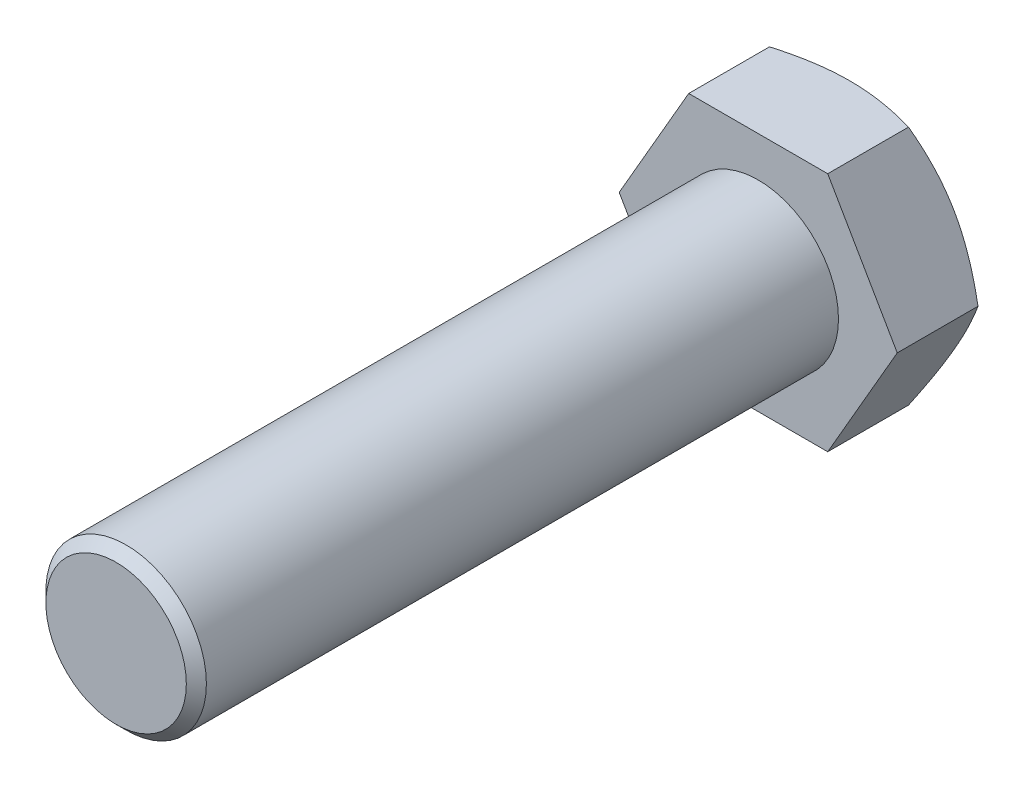
ISO-10303-21;
HEADER;
FILE_DESCRIPTION(('STEP AP214'),'2;1');
FILE_NAME('part.step','',(''),(''),'','','');
FILE_SCHEMA(('AUTOMOTIVE_DESIGN { 1 0 10303 214 1 1 1 1 }'));
ENDSEC;
DATA;
#1=APPLICATION_CONTEXT('core data for automotive mechanical design processes');
#2=APPLICATION_PROTOCOL_DEFINITION('international standard','automotive_design',2000,#1);
#3=PRODUCT_CONTEXT('',#1,'mechanical');
#4=PRODUCT('Part','Part','',(#3));
#5=PRODUCT_RELATED_PRODUCT_CATEGORY('part','',(#4));
#6=PRODUCT_DEFINITION_FORMATION('','',#4);
#7=PRODUCT_DEFINITION_CONTEXT('part definition',#1,'design');
#8=PRODUCT_DEFINITION('design','',#6,#7);
#9=PRODUCT_DEFINITION_SHAPE('','',#8);
#10=(LENGTH_UNIT() NAMED_UNIT(*) SI_UNIT(.MILLI.,.METRE.));
#11=(NAMED_UNIT(*) PLANE_ANGLE_UNIT() SI_UNIT($,.RADIAN.));
#12=(NAMED_UNIT(*) SI_UNIT($,.STERADIAN.) SOLID_ANGLE_UNIT());
#13=UNCERTAINTY_MEASURE_WITH_UNIT(LENGTH_MEASURE(1.E-05),#10,'distance_accuracy_value','');
#14=(GEOMETRIC_REPRESENTATION_CONTEXT(3) GLOBAL_UNCERTAINTY_ASSIGNED_CONTEXT((#13)) GLOBAL_UNIT_ASSIGNED_CONTEXT((#10,
#11,#12)) REPRESENTATION_CONTEXT('',''));
#15=CARTESIAN_POINT('',(0.,0.,0.));
#16=DIRECTION('',(0.,0.,1.));
#17=DIRECTION('',(1.,0.,0.));
#18=AXIS2_PLACEMENT_3D('',#15,#16,#17);
#19=CARTESIAN_POINT('',(0.,0.,0.));
#20=DIRECTION('',(0.,0.,1.));
#21=DIRECTION('',(1.,0.,0.));
#22=AXIS2_PLACEMENT_3D('',#19,#20,#21);
#23=PLANE('',#22);
#24=DIRECTION('',(-0.5,0.866025403784438,0.));
#25=VECTOR('',#24,1.);
#26=CARTESIAN_POINT('',(10.9985226280624,0.,0.));
#27=LINE('',#26,#25);
#28=CARTESIAN_POINT('',(10.9985226280624,0.,0.));
#29=VERTEX_POINT('',#28);
#30=CARTESIAN_POINT('',(5.49926131403118,9.525,0.));
#31=VERTEX_POINT('',#30);
#32=EDGE_CURVE('E251',#29,#31,#27,.T.);
#33=ORIENTED_EDGE('',*,*,#32,.T.);
#34=DIRECTION('',(-1.,0.,0.));
#35=VECTOR('',#34,1.);
#36=CARTESIAN_POINT('',(5.49926131403118,9.525,0.));
#37=LINE('',#36,#35);
#38=CARTESIAN_POINT('',(-5.49926131403119,9.525,0.));
#39=VERTEX_POINT('',#38);
#40=EDGE_CURVE('E271',#31,#39,#37,.T.);
#41=ORIENTED_EDGE('',*,*,#40,.T.);
#42=DIRECTION('',(-0.5,-0.866025403784439,0.));
#43=VECTOR('',#42,1.);
#44=CARTESIAN_POINT('',(-5.49926131403119,9.525,0.));
#45=LINE('',#44,#43);
#46=CARTESIAN_POINT('',(-10.9985226280624,0.,0.));
#47=VERTEX_POINT('',#46);
#48=EDGE_CURVE('E269',#39,#47,#45,.T.);
#49=ORIENTED_EDGE('',*,*,#48,.T.);
#50=DIRECTION('',(0.5,-0.866025403784438,0.));
#51=VECTOR('',#50,1.);
#52=CARTESIAN_POINT('',(-10.9985226280624,0.,0.));
#53=LINE('',#52,#51);
#54=CARTESIAN_POINT('',(-5.49926131403117,-9.52500000000001,0.));
#55=VERTEX_POINT('',#54);
#56=EDGE_CURVE('E126',#47,#55,#53,.T.);
#57=ORIENTED_EDGE('',*,*,#56,.T.);
#58=DIRECTION('',(1.,0.,0.));
#59=VECTOR('',#58,1.);
#60=CARTESIAN_POINT('',(-5.49926131403117,-9.52500000000001,0.));
#61=LINE('',#60,#59);
#62=CARTESIAN_POINT('',(5.49926131403119,-9.525,0.));
#63=VERTEX_POINT('',#62);
#64=EDGE_CURVE('E265',#55,#63,#61,.T.);
#65=ORIENTED_EDGE('',*,*,#64,.T.);
#66=DIRECTION('',(0.5,0.866025403784439,0.));
#67=VECTOR('',#66,1.);
#68=CARTESIAN_POINT('',(5.49926131403119,-9.525,0.));
#69=LINE('',#68,#67);
#70=EDGE_CURVE('E138',#63,#29,#69,.T.);
#71=ORIENTED_EDGE('',*,*,#70,.T.);
#72=EDGE_LOOP('',(#33,#41,#49,#57,#65,#71));
#73=FACE_BOUND('',#72,.T.);
#74=CARTESIAN_POINT('',(0.,0.,0.));
#75=DIRECTION('',(0.,0.,1.));
#76=DIRECTION('',(1.,0.,0.));
#77=AXIS2_PLACEMENT_3D('',#74,#75,#76);
#78=CIRCLE('',#77,6.35);
#79=CARTESIAN_POINT('',(6.35,0.,0.));
#80=VERTEX_POINT('',#79);
#81=EDGE_CURVE('E254',#80,#80,#78,.T.);
#82=ORIENTED_EDGE('',*,*,#81,.F.);
#83=EDGE_LOOP('',(#82));
#84=FACE_BOUND('',#83,.T.);
#85=ADVANCED_FACE('F33',(#73,#84),#23,.T.);
#86=CARTESIAN_POINT('',(10.9985226280624,0.,-7.239));
#87=DIRECTION('',(0.866025403784438,0.5,0.));
#88=DIRECTION('',(-0.5,0.866025403784439,0.));
#89=AXIS2_PLACEMENT_3D('',#86,#87,#88);
#90=PLANE('',#89);
#91=DIRECTION('',(0.,0.,1.));
#92=VECTOR('',#91,1.);
#93=CARTESIAN_POINT('',(10.9985226280624,0.,-7.239));
#94=LINE('',#93,#92);
#95=CARTESIAN_POINT('',(10.9985226280624,0.,-6.3882613140312));
#96=VERTEX_POINT('',#95);
#97=EDGE_CURVE('E142',#96,#29,#94,.T.);
#98=ORIENTED_EDGE('',*,*,#97,.F.);
#99=CARTESIAN_POINT('',(10.9986380981162,-0.000199999999994921,-6.38819464631467));
#100=CARTESIAN_POINT('',(10.8777523132173,0.20918032135782,-6.45797679875236));
#101=CARTESIAN_POINT('',(10.7564158029679,0.419341321922851,-6.52459176604214));
#102=CARTESIAN_POINT('',(10.5127697532954,0.841348659019081,-6.65060853020999));
#103=CARTESIAN_POINT('',(10.3904599078574,1.05319552558364,-6.71000795469023));
#104=CARTESIAN_POINT('',(10.0215595864394,1.69214962520808,-6.87623339529241));
#105=CARTESIAN_POINT('',(9.77351282584137,2.12177921721668,-6.97078167008118));
#106=CARTESIAN_POINT('',(9.40232220358294,2.76470023426138,-7.08164837115457));
#107=CARTESIAN_POINT('',(9.28028730086356,2.97607088606807,-7.11323013385105));
#108=CARTESIAN_POINT('',(9.03565248016183,3.39979082482397,-7.1661907468708));
#109=CARTESIAN_POINT('',(8.9130525513505,3.61214013052952,-7.18756940081897));
#110=CARTESIAN_POINT('',(8.66764818787802,4.03719295646296,-7.21957602332752));
#111=CARTESIAN_POINT('',(8.54484417077186,4.24989575346439,-7.2302167674145));
#112=CARTESIAN_POINT('',(8.29912270270345,4.67549782066928,-7.24052146504908));
#113=CARTESIAN_POINT('',(8.17620525536319,4.88839708459929,-7.24018575773535));
#114=CARTESIAN_POINT('',(7.94640807689151,5.28641747314822,-7.22930115976822));
#115=CARTESIAN_POINT('',(7.83951212670956,5.4715666899867,-7.22008005549243));
#116=CARTESIAN_POINT('',(7.62597023317658,5.84143209913029,-7.19351519898844));
#117=CARTESIAN_POINT('',(7.5193243080471,6.02614825987472,-7.17617087217475));
#118=CARTESIAN_POINT('',(7.19979976097279,6.57958100967286,-7.11236312197425));
#119=CARTESIAN_POINT('',(6.98748672019119,6.94731798341605,-7.05413287852844));
#120=CARTESIAN_POINT('',(6.56060850831896,7.68669273502289,-6.90855670802923));
#121=CARTESIAN_POINT('',(6.3460978161353,8.05823615265175,-6.82059370365355));
#122=CARTESIAN_POINT('',(5.92027529884848,8.79578238759941,-6.62095420264402));
#123=CARTESIAN_POINT('',(5.70895802095901,9.16179464942111,-6.50932459453986));
#124=CARTESIAN_POINT('',(5.49914584397735,9.5252,-6.38819464631468));
#125=B_SPLINE_CURVE_WITH_KNOTS('',3,(#99,#100,#101,#102,#103,#104,#105,#106,#107,#108,#109,#110,
#111,#112,#113,#114,#115,#116,#117,#118,#119,#120,#121,#122,#123,#124),.UNSPECIFIED.,.F.,.F.,(4,
2,2,2,2,2,2,2,2,2,2,2,4),(0.,0.754861746958002,1.50997101692211,3.0234040607515,
3.76154608748042,4.49970232035706,5.23697928598071,5.97423347202912,6.61604550518407,
7.25790294292823,8.54252993638601,9.85564695316762,11.1661863217646),.UNSPECIFIED.);
#126=CARTESIAN_POINT('',(8.24889197104678,4.7625,-7.239));
#127=VERTEX_POINT('',#126);
#128=EDGE_CURVE('E122',#96,#127,#125,.T.);
#129=ORIENTED_EDGE('',*,*,#128,.T.);
#130=CARTESIAN_POINT('',(5.49926131403118,9.525,-6.3882613140312));
#131=VERTEX_POINT('',#130);
#132=EDGE_CURVE('E217',#127,#131,#125,.T.);
#133=ORIENTED_EDGE('',*,*,#132,.T.);
#134=DIRECTION('',(0.,0.,1.));
#135=VECTOR('',#134,1.);
#136=CARTESIAN_POINT('',(5.49926131403118,9.525,-7.239));
#137=LINE('',#136,#135);
#138=EDGE_CURVE('E133',#131,#31,#137,.T.);
#139=ORIENTED_EDGE('',*,*,#138,.T.);
#140=ORIENTED_EDGE('',*,*,#32,.F.);
#141=EDGE_LOOP('',(#98,#129,#133,#139,#140));
#142=FACE_BOUND('',#141,.T.);
#143=ADVANCED_FACE('F222',(#142),#90,.T.);
#144=CARTESIAN_POINT('',(5.49926131403119,-9.525,-7.239));
#145=DIRECTION('',(0.866025403784439,-0.5,0.));
#146=DIRECTION('',(0.5,0.866025403784439,0.));
#147=AXIS2_PLACEMENT_3D('',#144,#145,#146);
#148=PLANE('',#147);
#149=DIRECTION('',(0.,0.,1.));
#150=VECTOR('',#149,1.);
#151=CARTESIAN_POINT('',(5.49926131403119,-9.525,-7.239));
#152=LINE('',#151,#150);
#153=CARTESIAN_POINT('',(5.49926131403118,-9.525,-6.3882613140312));
#154=VERTEX_POINT('',#153);
#155=EDGE_CURVE('E131',#154,#63,#152,.T.);
#156=ORIENTED_EDGE('',*,*,#155,.F.);
#157=CARTESIAN_POINT('',(5.49914584397735,-9.5252,-6.38819464631467));
#158=CARTESIAN_POINT('',(5.6200316288763,-9.31581967864219,-6.45797679875236));
#159=CARTESIAN_POINT('',(5.74136813912568,-9.10565867807716,-6.52459176604213));
#160=CARTESIAN_POINT('',(5.98501418879818,-8.68365134098092,-6.65060853020998));
#161=CARTESIAN_POINT('',(6.10732403423621,-8.47180447441637,-6.71000795469023));
#162=CARTESIAN_POINT('',(6.47622435565419,-7.83285037479193,-6.87623339529241));
#163=CARTESIAN_POINT('',(6.72427111625219,-7.40322078278332,-6.97078167008118));
#164=CARTESIAN_POINT('',(7.09546173851062,-6.76029976573862,-7.08164837115457));
#165=CARTESIAN_POINT('',(7.21749664122999,-6.54892911393193,-7.11323013385105));
#166=CARTESIAN_POINT('',(7.46213146193172,-6.12520917517604,-7.1661907468708));
#167=CARTESIAN_POINT('',(7.58473139074305,-5.91285986947049,-7.18756940081897));
#168=CARTESIAN_POINT('',(7.83013575421554,-5.48780704353704,-7.21957602332752));
#169=CARTESIAN_POINT('',(7.9529397713217,-5.27510424653562,-7.2302167674145));
#170=CARTESIAN_POINT('',(8.1986612393901,-4.84950217933072,-7.24052146504908));
#171=CARTESIAN_POINT('',(8.32157868673037,-4.63660291540071,-7.24018575773535));
#172=CARTESIAN_POINT('',(8.55137586520205,-4.23858252685179,-7.22930115976822));
#173=CARTESIAN_POINT('',(8.65827181538399,-4.05343331001331,-7.22008005549243));
#174=CARTESIAN_POINT('',(8.87181370891698,-3.68356790086971,-7.19351519898844));
#175=CARTESIAN_POINT('',(8.97845963404645,-3.49885174012528,-7.17617087217475));
#176=CARTESIAN_POINT('',(9.29798418112076,-2.94541899032714,-7.11236312197425));
#177=CARTESIAN_POINT('',(9.51029722190237,-2.57768201658395,-7.05413287852844));
#178=CARTESIAN_POINT('',(9.93717543377459,-1.83830726497711,-6.90855670802923));
#179=CARTESIAN_POINT('',(10.1516861259582,-1.46676384734824,-6.82059370365355));
#180=CARTESIAN_POINT('',(10.5775086432451,-0.729217612400583,-6.62095420264402));
#181=CARTESIAN_POINT('',(10.7888259211345,-0.363205350578882,-6.50932459453986));
#182=CARTESIAN_POINT('',(10.9986380981162,0.000200000000004332,-6.38819464631467));
#183=B_SPLINE_CURVE_WITH_KNOTS('',3,(#157,#158,#159,#160,#161,#162,#163,#164,#165,#166,#167,
#168,#169,#170,#171,#172,#173,#174,#175,#176,#177,#178,#179,#180,#181,#182),.UNSPECIFIED.,.F.,
.F.,(4,2,2,2,2,2,2,2,2,2,2,2,4),(0.,0.754861746958004,1.50997101692211,3.02340406075151,
3.76154608748042,4.49970232035706,5.23697928598072,5.97423347202912,6.61604550518407,
7.25790294292823,8.54252993638601,9.85564695316763,11.1661863217647),.UNSPECIFIED.);
#184=CARTESIAN_POINT('',(8.24889197104678,-4.7625,-7.239));
#185=VERTEX_POINT('',#184);
#186=EDGE_CURVE('E158',#154,#185,#183,.T.);
#187=ORIENTED_EDGE('',*,*,#186,.T.);
#188=EDGE_CURVE('E111',#185,#96,#183,.T.);
#189=ORIENTED_EDGE('',*,*,#188,.T.);
#190=ORIENTED_EDGE('',*,*,#97,.T.);
#191=ORIENTED_EDGE('',*,*,#70,.F.);
#192=EDGE_LOOP('',(#156,#187,#189,#190,#191));
#193=FACE_BOUND('',#192,.T.);
#194=ADVANCED_FACE('F173',(#193),#148,.T.);
#195=CARTESIAN_POINT('',(-5.49926131403117,-9.52500000000001,-7.239));
#196=DIRECTION('',(0.,-1.,0.));
#197=DIRECTION('',(1.,0.,0.));
#198=AXIS2_PLACEMENT_3D('',#195,#196,#197);
#199=PLANE('',#198);
#200=DIRECTION('',(0.,0.,1.));
#201=VECTOR('',#200,1.);
#202=CARTESIAN_POINT('',(-5.49926131403117,-9.52500000000001,-7.239));
#203=LINE('',#202,#201);
#204=CARTESIAN_POINT('',(-5.49926131403118,-9.52500000000001,-6.3882613140312));
#205=VERTEX_POINT('',#204);
#206=EDGE_CURVE('E128',#205,#55,#203,.T.);
#207=ORIENTED_EDGE('',*,*,#206,.F.);
#208=CARTESIAN_POINT('',(-14.5848514260898,-9.52500000000001,-2.68103313192076));
#209=CARTESIAN_POINT('',(-14.3757585121413,-9.52500000000001,-2.78210554675537));
#210=CARTESIAN_POINT('',(-14.1664128636962,-9.52500000000001,-2.88265486746429));
#211=CARTESIAN_POINT('',(-13.747162716616,-9.52500000000001,-3.08258724839842));
#212=CARTESIAN_POINT('',(-13.5372582118854,-9.52500000000001,-3.18197029583857));
#213=CARTESIAN_POINT('',(-12.906564840945,-9.52500000000001,-3.47821872789398));
#214=CARTESIAN_POINT('',(-12.4848640989599,-9.52500000000001,-3.67315044626707));
#215=CARTESIAN_POINT('',(-11.6361353309768,-9.52500000000001,-4.05771439376794));
#216=CARTESIAN_POINT('',(-11.2090906289847,-9.52500000000001,-4.24730991241434));
#217=CARTESIAN_POINT('',(-10.3514920507466,-9.52500000000001,-4.61836058535969));
#218=CARTESIAN_POINT('',(-9.92093835880329,-9.52500000000001,-4.79981616397824));
#219=CARTESIAN_POINT('',(-9.0502907929759,-9.52500000000001,-5.15457151558343));
#220=CARTESIAN_POINT('',(-8.61014468925986,-9.52500000000001,-5.32774381120678));
#221=CARTESIAN_POINT('',(-7.72466213542342,-9.52500000000001,-5.66052594327856));
#222=CARTESIAN_POINT('',(-7.27932511409067,-9.52500000000001,-5.82013427080646));
#223=CARTESIAN_POINT('',(-6.3836613329774,-9.52500000000001,-6.12149889943293));
#224=CARTESIAN_POINT('',(-5.93334748427704,-9.52500000000001,-6.26329315388556));
#225=CARTESIAN_POINT('',(-5.02633416867646,-9.52500000000001,-6.52442703659587));
#226=CARTESIAN_POINT('',(-4.56963677039888,-9.52500000000001,-6.64377376580489));
#227=CARTESIAN_POINT('',(-3.64946810096751,-9.52500000000001,-6.85420992638798));
#228=CARTESIAN_POINT('',(-3.18599506051234,-9.525,-6.94529183389425));
#229=CARTESIAN_POINT('',(-2.48670711335144,-9.525,-7.05615552989782));
#230=CARTESIAN_POINT('',(-2.25290271066244,-9.525,-7.08881930690078));
#231=CARTESIAN_POINT('',(-1.78419772762086,-9.525,-7.1449177834731));
#232=CARTESIAN_POINT('',(-1.54929725812148,-9.525,-7.16835339672454));
#233=CARTESIAN_POINT('',(-1.08020777715576,-9.525,-7.20536486203012));
#234=CARTESIAN_POINT('',(-0.846023616026403,-9.525,-7.21900194006364));
#235=CARTESIAN_POINT('',(-0.377287951032391,-9.525,-7.23634423552121));
#236=CARTESIAN_POINT('',(-0.142736451977726,-9.525,-7.24004958192299));
#237=CARTESIAN_POINT('',(0.326245741164637,-9.525,-7.23744012423018));
#238=CARTESIAN_POINT('',(0.560676450681649,-9.525,-7.23112813226288));
#239=CARTESIAN_POINT('',(1.02906749638298,-9.525,-7.2086409602398));
#240=CARTESIAN_POINT('',(1.26302780849203,-9.525,-7.19246528762909));
#241=CARTESIAN_POINT('',(1.83007556949539,-9.525,-7.141644352162));
#242=CARTESIAN_POINT('',(2.16272734658029,-9.525,-7.10205703256404));
#243=CARTESIAN_POINT('',(2.82548182093543,-9.525,-7.00513945561934));
#244=CARTESIAN_POINT('',(3.15558379720053,-9.525,-6.94780435536234));
#245=CARTESIAN_POINT('',(3.81296633944766,-9.525,-6.81742470975663));
#246=CARTESIAN_POINT('',(4.14024393133904,-9.525,-6.74436531102873));
#247=CARTESIAN_POINT('',(4.79143189370414,-9.525,-6.58476619726766));
#248=CARTESIAN_POINT('',(5.11534257832303,-9.525,-6.49822775214509));
#249=CARTESIAN_POINT('',(5.76777457470679,-9.525,-6.31147877500175));
#250=CARTESIAN_POINT('',(6.0962142824533,-9.525,-6.21098510686575));
#251=CARTESIAN_POINT('',(6.74962208193335,-9.525,-6.00006841523837));
#252=CARTESIAN_POINT('',(7.07459239758527,-9.525,-5.88965224042136));
#253=CARTESIAN_POINT('',(7.71975742553682,-9.525,-5.66117128989833));
#254=CARTESIAN_POINT('',(8.03996872244832,-9.525,-5.5431530638559));
#255=CARTESIAN_POINT('',(8.67790692067937,-9.525,-5.30018961397412));
#256=CARTESIAN_POINT('',(8.99563275784031,-9.525,-5.17524159047859));
#257=CARTESIAN_POINT('',(9.31220433212002,-9.525,-5.04751417817255));
#258=B_SPLINE_CURVE_WITH_KNOTS('',3,(#208,#209,#210,#211,#212,#213,#214,#215,#216,#217,#218,
#219,#220,#221,#222,#223,#224,#225,#226,#227,#228,#229,#230,#231,#232,#233,#234,#235,#236,#237,
#238,#239,#240,#241,#242,#243,#244,#245,#246,#247,#248,#249,#250,#251,#252,#253,#254,#255,#256,
#257),.UNSPECIFIED.,.F.,.F.,(4,2,2,2,2,2,2,2,2,2,2,2,2,2,2,2,2,2,2,2,2,2,2,2,4),(0.,
0.696719050831161,1.39344573218638,2.78712572533338,4.18878118622646,5.59036349637626,
7.00915288747145,8.42809990542333,9.84397061683018,11.2593926818532,12.6751911982718,
13.383262743619,14.0912641650418,14.7948022429185,15.498331184305,16.2016626617624,
16.9050292638122,17.9094666753597,18.9141784138717,19.9198434146362,20.9254137252445,
21.9556327373916,22.9851460585411,24.0088645870761,25.0329997567141),.UNSPECIFIED.);
#259=CARTESIAN_POINT('',(0.,-9.525,-7.239));
#260=VERTEX_POINT('',#259);
#261=EDGE_CURVE('E272',#205,#260,#258,.T.);
#262=ORIENTED_EDGE('',*,*,#261,.T.);
#263=EDGE_CURVE('E160',#260,#154,#258,.T.);
#264=ORIENTED_EDGE('',*,*,#263,.T.);
#265=ORIENTED_EDGE('',*,*,#155,.T.);
#266=ORIENTED_EDGE('',*,*,#64,.F.);
#267=EDGE_LOOP('',(#207,#262,#264,#265,#266));
#268=FACE_BOUND('',#267,.T.);
#269=ADVANCED_FACE('F234',(#268),#199,.T.);
#270=CARTESIAN_POINT('',(-10.9985226280624,0.,-7.239));
#271=DIRECTION('',(-0.866025403784438,-0.5,0.));
#272=DIRECTION('',(0.5,-0.866025403784438,0.));
#273=AXIS2_PLACEMENT_3D('',#270,#271,#272);
#274=PLANE('',#273);
#275=DIRECTION('',(0.,0.,1.));
#276=VECTOR('',#275,1.);
#277=CARTESIAN_POINT('',(-10.9985226280624,0.,-7.239));
#278=LINE('',#277,#276);
#279=CARTESIAN_POINT('',(-10.9985226280624,0.,-6.3882613140312));
#280=VERTEX_POINT('',#279);
#281=EDGE_CURVE('E119',#280,#47,#278,.T.);
#282=ORIENTED_EDGE('',*,*,#281,.F.);
#283=CARTESIAN_POINT('',(-10.9986380981162,0.000199999999994796,-6.38819464631468));
#284=CARTESIAN_POINT('',(-10.8777523132173,-0.20918032135782,-6.45797679875236));
#285=CARTESIAN_POINT('',(-10.7564158029679,-0.41934132192285,-6.52459176604214));
#286=CARTESIAN_POINT('',(-10.5127697532954,-0.841348659019081,-6.65060853020999));
#287=CARTESIAN_POINT('',(-10.3904599078573,-1.05319552558364,-6.71000795469024));
#288=CARTESIAN_POINT('',(-10.0215595864394,-1.69214962520808,-6.87623339529241));
#289=CARTESIAN_POINT('',(-9.77351282584136,-2.12177921721668,-6.97078167008118));
#290=CARTESIAN_POINT('',(-9.40232220358294,-2.76470023426138,-7.08164837115457));
#291=CARTESIAN_POINT('',(-9.28028730086356,-2.97607088606807,-7.11323013385105));
#292=CARTESIAN_POINT('',(-9.03565248016183,-3.39979082482397,-7.1661907468708));
#293=CARTESIAN_POINT('',(-8.9130525513505,-3.61214013052952,-7.18756940081897));
#294=CARTESIAN_POINT('',(-8.66764818787801,-4.03719295646296,-7.21957602332752));
#295=CARTESIAN_POINT('',(-8.54484417077186,-4.24989575346439,-7.2302167674145));
#296=CARTESIAN_POINT('',(-8.29912270270345,-4.67549782066928,-7.24052146504908));
#297=CARTESIAN_POINT('',(-8.17620525536318,-4.88839708459929,-7.24018575773535));
#298=CARTESIAN_POINT('',(-7.9464080768915,-5.28641747314822,-7.22930115976822));
#299=CARTESIAN_POINT('',(-7.83951212670956,-5.4715666899867,-7.22008005549244));
#300=CARTESIAN_POINT('',(-7.62597023317657,-5.84143209913029,-7.19351519898844));
#301=CARTESIAN_POINT('',(-7.5193243080471,-6.02614825987472,-7.17617087217475));
#302=CARTESIAN_POINT('',(-7.19979976097279,-6.57958100967286,-7.11236312197426));
#303=CARTESIAN_POINT('',(-6.98748672019118,-6.94731798341605,-7.05413287852844));
#304=CARTESIAN_POINT('',(-6.56060850831896,-7.68669273502289,-6.90855670802923));
#305=CARTESIAN_POINT('',(-6.3460978161353,-8.05823615265176,-6.82059370365355));
#306=CARTESIAN_POINT('',(-5.92027529884847,-8.79578238759942,-6.62095420264402));
#307=CARTESIAN_POINT('',(-5.70895802095901,-9.16179464942112,-6.50932459453986));
#308=CARTESIAN_POINT('',(-5.49914584397734,-9.52520000000001,-6.38819464631467));
#309=B_SPLINE_CURVE_WITH_KNOTS('',3,(#283,#284,#285,#286,#287,#288,#289,#290,#291,#292,#293,
#294,#295,#296,#297,#298,#299,#300,#301,#302,#303,#304,#305,#306,#307,#308),.UNSPECIFIED.,.F.,
.F.,(4,2,2,2,2,2,2,2,2,2,2,2,4),(0.,0.754861746958001,1.50997101692211,3.0234040607515,
3.76154608748042,4.49970232035706,5.23697928598071,5.97423347202912,6.61604550518407,
7.25790294292823,8.54252993638601,9.85564695316763,11.1661863217647),.UNSPECIFIED.);
#310=CARTESIAN_POINT('',(-8.24889197104678,-4.76250000000001,-7.239));
#311=VERTEX_POINT('',#310);
#312=EDGE_CURVE('E103',#280,#311,#309,.T.);
#313=ORIENTED_EDGE('',*,*,#312,.T.);
#314=EDGE_CURVE('E113',#311,#205,#309,.T.);
#315=ORIENTED_EDGE('',*,*,#314,.T.);
#316=ORIENTED_EDGE('',*,*,#206,.T.);
#317=ORIENTED_EDGE('',*,*,#56,.F.);
#318=EDGE_LOOP('',(#282,#313,#315,#316,#317));
#319=FACE_BOUND('',#318,.T.);
#320=ADVANCED_FACE('F124',(#319),#274,.T.);
#321=CARTESIAN_POINT('',(-5.49926131403119,9.525,-7.239));
#322=DIRECTION('',(-0.866025403784439,0.5,0.));
#323=DIRECTION('',(-0.5,-0.866025403784439,0.));
#324=AXIS2_PLACEMENT_3D('',#321,#322,#323);
#325=PLANE('',#324);
#326=DIRECTION('',(0.,0.,1.));
#327=VECTOR('',#326,1.);
#328=CARTESIAN_POINT('',(-5.49926131403119,9.525,-7.239));
#329=LINE('',#328,#327);
#330=CARTESIAN_POINT('',(-5.49926131403119,9.525,-6.3882613140312));
#331=VERTEX_POINT('',#330);
#332=EDGE_CURVE('E129',#331,#39,#329,.T.);
#333=ORIENTED_EDGE('',*,*,#332,.F.);
#334=CARTESIAN_POINT('',(-5.49914584397735,9.5252,-6.38819464631467));
#335=CARTESIAN_POINT('',(-5.62003162887629,9.31581967864218,-6.45797679875236));
#336=CARTESIAN_POINT('',(-5.74136813912567,9.10565867807715,-6.52459176604214));
#337=CARTESIAN_POINT('',(-5.98501418879818,8.68365134098092,-6.65060853020999));
#338=CARTESIAN_POINT('',(-6.10732403423621,8.47180447441636,-6.71000795469023));
#339=CARTESIAN_POINT('',(-6.47622435565419,7.83285037479192,-6.87623339529241));
#340=CARTESIAN_POINT('',(-6.72427111625219,7.40322078278332,-6.97078167008118));
#341=CARTESIAN_POINT('',(-7.09546173851061,6.76029976573862,-7.08164837115457));
#342=CARTESIAN_POINT('',(-7.21749664122999,6.54892911393193,-7.11323013385105));
#343=CARTESIAN_POINT('',(-7.46213146193172,6.12520917517603,-7.1661907468708));
#344=CARTESIAN_POINT('',(-7.58473139074305,5.91285986947048,-7.18756940081897));
#345=CARTESIAN_POINT('',(-7.83013575421554,5.48780704353704,-7.21957602332752));
#346=CARTESIAN_POINT('',(-7.95293977132169,5.27510424653561,-7.2302167674145));
#347=CARTESIAN_POINT('',(-8.1986612393901,4.84950217933072,-7.24052146504908));
#348=CARTESIAN_POINT('',(-8.32157868673036,4.63660291540071,-7.24018575773535));
#349=CARTESIAN_POINT('',(-8.55137586520205,4.23858252685178,-7.22930115976822));
#350=CARTESIAN_POINT('',(-8.65827181538399,4.0534333100133,-7.22008005549244));
#351=CARTESIAN_POINT('',(-8.87181370891697,3.68356790086971,-7.19351519898844));
#352=CARTESIAN_POINT('',(-8.97845963404645,3.49885174012528,-7.17617087217475));
#353=CARTESIAN_POINT('',(-9.29798418112076,2.94541899032713,-7.11236312197426));
#354=CARTESIAN_POINT('',(-9.51029722190237,2.57768201658395,-7.05413287852845));
#355=CARTESIAN_POINT('',(-9.93717543377459,1.83830726497711,-6.90855670802923));
#356=CARTESIAN_POINT('',(-10.1516861259582,1.46676384734824,-6.82059370365355));
#357=CARTESIAN_POINT('',(-10.5775086432451,0.72921761240058,-6.62095420264402));
#358=CARTESIAN_POINT('',(-10.7888259211345,0.36320535057888,-6.50932459453986));
#359=CARTESIAN_POINT('',(-10.9986380981162,-0.000200000000004653,-6.38819464631468));
#360=B_SPLINE_CURVE_WITH_KNOTS('',3,(#334,#335,#336,#337,#338,#339,#340,#341,#342,#343,#344,
#345,#346,#347,#348,#349,#350,#351,#352,#353,#354,#355,#356,#357,#358,#359),.UNSPECIFIED.,.F.,
.F.,(4,2,2,2,2,2,2,2,2,2,2,2,4),(0.,0.754861746958,1.50997101692211,3.0234040607515,
3.76154608748042,4.49970232035706,5.23697928598071,5.97423347202912,6.61604550518407,
7.25790294292823,8.54252993638601,9.85564695316763,11.1661863217647),.UNSPECIFIED.);
#361=CARTESIAN_POINT('',(-8.24889197104678,4.7625,-7.239));
#362=VERTEX_POINT('',#361);
#363=EDGE_CURVE('E121',#331,#362,#360,.T.);
#364=ORIENTED_EDGE('',*,*,#363,.T.);
#365=EDGE_CURVE('E56',#362,#280,#360,.T.);
#366=ORIENTED_EDGE('',*,*,#365,.T.);
#367=ORIENTED_EDGE('',*,*,#281,.T.);
#368=ORIENTED_EDGE('',*,*,#48,.F.);
#369=EDGE_LOOP('',(#333,#364,#366,#367,#368));
#370=FACE_BOUND('',#369,.T.);
#371=ADVANCED_FACE('F117',(#370),#325,.T.);
#372=CARTESIAN_POINT('',(5.49926131403118,9.525,-7.239));
#373=DIRECTION('',(0.,1.,0.));
#374=DIRECTION('',(-1.,0.,0.));
#375=AXIS2_PLACEMENT_3D('',#372,#373,#374);
#376=PLANE('',#375);
#377=ORIENTED_EDGE('',*,*,#138,.F.);
#378=CARTESIAN_POINT('',(-14.5848514260895,9.525,-2.68103313192089));
#379=CARTESIAN_POINT('',(-14.375758512141,9.525,-2.7821055467555));
#380=CARTESIAN_POINT('',(-14.1664128636959,9.525,-2.88265486746442));
#381=CARTESIAN_POINT('',(-13.7471627166157,9.525,-3.08258724839854));
#382=CARTESIAN_POINT('',(-13.5372582118851,9.525,-3.1819702958387));
#383=CARTESIAN_POINT('',(-12.9065648409447,9.525,-3.4782187278941));
#384=CARTESIAN_POINT('',(-12.4848640989597,9.525,-3.67315044626719));
#385=CARTESIAN_POINT('',(-11.6361353309766,9.525,-4.05771439376806));
#386=CARTESIAN_POINT('',(-11.2090906289845,9.525,-4.24730991241446));
#387=CARTESIAN_POINT('',(-10.3514920507463,9.525,-4.6183605853598));
#388=CARTESIAN_POINT('',(-9.92093835880304,9.525,-4.79981616397835));
#389=CARTESIAN_POINT('',(-9.05029079297566,9.525,-5.15457151558353));
#390=CARTESIAN_POINT('',(-8.61014468925962,9.525,-5.32774381120688));
#391=CARTESIAN_POINT('',(-7.72466213542318,9.525,-5.66052594327866));
#392=CARTESIAN_POINT('',(-7.27932511409043,9.525,-5.82013427080655));
#393=CARTESIAN_POINT('',(-6.38366133297716,9.525,-6.121498899433));
#394=CARTESIAN_POINT('',(-5.93334748427681,9.525,-6.26329315388563));
#395=CARTESIAN_POINT('',(-5.02633416867623,9.525,-6.52442703659593));
#396=CARTESIAN_POINT('',(-4.56963677039866,9.525,-6.64377376580495));
#397=CARTESIAN_POINT('',(-3.64946810096729,9.525,-6.85420992638803));
#398=CARTESIAN_POINT('',(-3.18599506051212,9.525,-6.9452918338943));
#399=CARTESIAN_POINT('',(-2.48670711335122,9.525,-7.05615552989786));
#400=CARTESIAN_POINT('',(-2.25290271066222,9.525,-7.08881930690082));
#401=CARTESIAN_POINT('',(-1.78419772762065,9.525,-7.14491778347313));
#402=CARTESIAN_POINT('',(-1.54929725812127,9.525,-7.16835339672457));
#403=CARTESIAN_POINT('',(-1.08020777715555,9.525,-7.20536486203014));
#404=CARTESIAN_POINT('',(-0.846023616026189,9.525,-7.21900194006365));
#405=CARTESIAN_POINT('',(-0.377287951032178,9.525,-7.23634423552122));
#406=CARTESIAN_POINT('',(-0.142736451977513,9.525,-7.24004958192299));
#407=CARTESIAN_POINT('',(0.326245741164849,9.525,-7.23744012423018));
#408=CARTESIAN_POINT('',(0.560676450681861,9.525,-7.23112813226288));
#409=CARTESIAN_POINT('',(1.02906749638319,9.525,-7.20864096023979));
#410=CARTESIAN_POINT('',(1.26302780849224,9.525,-7.19246528762908));
#411=CARTESIAN_POINT('',(1.8300755694956,9.525,-7.14164435216198));
#412=CARTESIAN_POINT('',(2.16272734658051,9.525,-7.10205703256401));
#413=CARTESIAN_POINT('',(2.82548182093567,9.525,-7.00513945561931));
#414=CARTESIAN_POINT('',(3.15558379720077,9.525,-6.9478043553623));
#415=CARTESIAN_POINT('',(3.81296633944792,9.525,-6.81742470975658));
#416=CARTESIAN_POINT('',(4.14024393133931,9.525,-6.74436531102867));
#417=CARTESIAN_POINT('',(4.79143189370442,9.525,-6.58476619726759));
#418=CARTESIAN_POINT('',(5.11534257832331,9.525,-6.49822775214501));
#419=CARTESIAN_POINT('',(5.76777457470708,9.525,-6.31147877500166));
#420=CARTESIAN_POINT('',(6.0962142824536,9.525,-6.21098510686566));
#421=CARTESIAN_POINT('',(6.74962208193366,9.525,-6.00006841523827));
#422=CARTESIAN_POINT('',(7.07459239758558,9.525,-5.88965224042125));
#423=CARTESIAN_POINT('',(7.71975742553715,9.525,-5.66117128989821));
#424=CARTESIAN_POINT('',(8.03996872244866,9.525,-5.54315306385577));
#425=CARTESIAN_POINT('',(8.67790692067971,9.525,-5.30018961397398));
#426=CARTESIAN_POINT('',(8.99563275784066,9.525,-5.17524159047845));
#427=CARTESIAN_POINT('',(9.31220433212038,9.525,-5.0475141781724));
#428=B_SPLINE_CURVE_WITH_KNOTS('',3,(#378,#379,#380,#381,#382,#383,#384,#385,#386,#387,#388,
#389,#390,#391,#392,#393,#394,#395,#396,#397,#398,#399,#400,#401,#402,#403,#404,#405,#406,#407,
#408,#409,#410,#411,#412,#413,#414,#415,#416,#417,#418,#419,#420,#421,#422,#423,#424,#425,#426,
#427),.UNSPECIFIED.,.F.,.F.,(4,2,2,2,2,2,2,2,2,2,2,2,2,2,2,2,2,2,2,2,2,2,2,2,4),(0.,
0.696719050831158,1.39344573218637,2.78712572533336,4.18878118622644,5.59036349637624,
7.00915288747142,8.42809990542329,9.84397061683013,11.2593926818531,12.6751911982717,
13.383262743619,14.0912641650417,14.7948022429184,15.4983311843049,16.2016626617623,
16.9050292638121,17.9094666753597,18.9141784138716,19.9198434146362,20.9254137252445,
21.9556327373916,22.9851460585412,24.0088645870762,25.0329997567142),.UNSPECIFIED.);
#429=CARTESIAN_POINT('',(0.,9.525,-7.239));
#430=VERTEX_POINT('',#429);
#431=EDGE_CURVE('E259',#131,#430,#428,.F.);
#432=ORIENTED_EDGE('',*,*,#431,.T.);
#433=EDGE_CURVE('E48',#430,#331,#428,.F.);
#434=ORIENTED_EDGE('',*,*,#433,.T.);
#435=ORIENTED_EDGE('',*,*,#332,.T.);
#436=ORIENTED_EDGE('',*,*,#40,.F.);
#437=EDGE_LOOP('',(#377,#432,#434,#435,#436));
#438=FACE_BOUND('',#437,.T.);
#439=ADVANCED_FACE('F226',(#438),#376,.T.);
#440=CARTESIAN_POINT('',(0.,0.,-7.239));
#441=DIRECTION('',(0.,0.,1.));
#442=DIRECTION('',(1.,0.,0.));
#443=AXIS2_PLACEMENT_3D('',#440,#441,#442);
#444=CONICAL_SURFACE('',#443,9.525,1.0471975511966);
#445=CARTESIAN_POINT('',(0.,0.,-7.239));
#446=DIRECTION('',(0.,0.,1.));
#447=DIRECTION('',(1.,0.,0.));
#448=AXIS2_PLACEMENT_3D('',#445,#446,#447);
#449=CIRCLE('',#448,9.525);
#450=EDGE_CURVE('E139',#185,#127,#449,.T.);
#451=ORIENTED_EDGE('',*,*,#450,.T.);
#452=ORIENTED_EDGE('',*,*,#128,.F.);
#453=ORIENTED_EDGE('',*,*,#188,.F.);
#454=EDGE_LOOP('',(#451,#452,#453));
#455=FACE_BOUND('',#454,.T.);
#456=ADVANCED_FACE('F166',(#455),#444,.T.);
#457=EDGE_CURVE('E141',#260,#185,#449,.T.);
#458=ORIENTED_EDGE('',*,*,#457,.T.);
#459=ORIENTED_EDGE('',*,*,#186,.F.);
#460=ORIENTED_EDGE('',*,*,#263,.F.);
#461=EDGE_LOOP('',(#458,#459,#460));
#462=FACE_BOUND('',#461,.T.);
#463=ADVANCED_FACE('F156',(#462),#444,.T.);
#464=ORIENTED_EDGE('',*,*,#314,.F.);
#465=EDGE_CURVE('E150',#311,#260,#449,.T.);
#466=ORIENTED_EDGE('',*,*,#465,.T.);
#467=ORIENTED_EDGE('',*,*,#261,.F.);
#468=EDGE_LOOP('',(#464,#466,#467));
#469=FACE_BOUND('',#468,.T.);
#470=ADVANCED_FACE('F199',(#469),#444,.T.);
#471=ORIENTED_EDGE('',*,*,#365,.F.);
#472=EDGE_CURVE('E106',#362,#311,#449,.T.);
#473=ORIENTED_EDGE('',*,*,#472,.T.);
#474=ORIENTED_EDGE('',*,*,#312,.F.);
#475=EDGE_LOOP('',(#471,#473,#474));
#476=FACE_BOUND('',#475,.T.);
#477=ADVANCED_FACE('F104',(#476),#444,.T.);
#478=ORIENTED_EDGE('',*,*,#433,.F.);
#479=CARTESIAN_POINT('',(0.,0.,-7.239));
#480=DIRECTION('',(0.,0.,-1.));
#481=DIRECTION('',(-1.,0.,0.));
#482=AXIS2_PLACEMENT_3D('',#479,#480,#481);
#483=CIRCLE('',#482,9.525);
#484=EDGE_CURVE('E256',#362,#430,#483,.T.);
#485=ORIENTED_EDGE('',*,*,#484,.F.);
#486=ORIENTED_EDGE('',*,*,#363,.F.);
#487=EDGE_LOOP('',(#478,#485,#486));
#488=FACE_BOUND('',#487,.T.);
#489=ADVANCED_FACE('F193',(#488),#444,.T.);
#490=EDGE_CURVE('E143',#127,#430,#449,.T.);
#491=ORIENTED_EDGE('',*,*,#490,.T.);
#492=ORIENTED_EDGE('',*,*,#431,.F.);
#493=ORIENTED_EDGE('',*,*,#132,.F.);
#494=EDGE_LOOP('',(#491,#492,#493));
#495=FACE_BOUND('',#494,.T.);
#496=ADVANCED_FACE('F198',(#495),#444,.T.);
#497=CARTESIAN_POINT('',(0.,0.,-7.239));
#498=DIRECTION('',(0.,0.,1.));
#499=DIRECTION('',(1.,0.,0.));
#500=AXIS2_PLACEMENT_3D('',#497,#498,#499);
#501=PLANE('',#500);
#502=ORIENTED_EDGE('',*,*,#490,.F.);
#503=ORIENTED_EDGE('',*,*,#450,.F.);
#504=ORIENTED_EDGE('',*,*,#457,.F.);
#505=ORIENTED_EDGE('',*,*,#465,.F.);
#506=ORIENTED_EDGE('',*,*,#472,.F.);
#507=ORIENTED_EDGE('',*,*,#484,.T.);
#508=EDGE_LOOP('',(#502,#503,#504,#505,#506,#507));
#509=FACE_BOUND('',#508,.T.);
#510=ADVANCED_FACE('F171',(#509),#501,.F.);
#511=CARTESIAN_POINT('',(0.,0.,50.8));
#512=DIRECTION('',(0.,0.,-1.));
#513=DIRECTION('',(-1.,0.,0.));
#514=AXIS2_PLACEMENT_3D('',#511,#512,#513);
#515=CYLINDRICAL_SURFACE('',#514,6.35);
#516=CARTESIAN_POINT('',(0.,0.,50.00625));
#517=DIRECTION('',(0.,0.,1.));
#518=DIRECTION('',(1.,0.,0.));
#519=AXIS2_PLACEMENT_3D('',#516,#517,#518);
#520=CIRCLE('',#519,6.35);
#521=CARTESIAN_POINT('',(6.35,0.,50.00625));
#522=VERTEX_POINT('',#521);
#523=EDGE_CURVE('E11',#522,#522,#520,.F.);
#524=ORIENTED_EDGE('',*,*,#523,.T.);
#525=EDGE_LOOP('',(#524));
#526=FACE_BOUND('',#525,.T.);
#527=ORIENTED_EDGE('',*,*,#81,.T.);
#528=EDGE_LOOP('',(#527));
#529=FACE_BOUND('',#528,.T.);
#530=ADVANCED_FACE('F200',(#526,#529),#515,.T.);
#531=CARTESIAN_POINT('',(0.,0.,50.8));
#532=DIRECTION('',(0.,0.,1.));
#533=DIRECTION('',(1.,0.,0.));
#534=AXIS2_PLACEMENT_3D('',#531,#532,#533);
#535=PLANE('',#534);
#536=CARTESIAN_POINT('',(0.,0.,50.8));
#537=DIRECTION('',(0.,0.,1.));
#538=DIRECTION('',(1.,0.,0.));
#539=AXIS2_PLACEMENT_3D('',#536,#537,#538);
#540=CIRCLE('',#539,5.55625);
#541=CARTESIAN_POINT('',(5.55625,0.,50.8));
#542=VERTEX_POINT('',#541);
#543=EDGE_CURVE('E41',#542,#542,#540,.T.);
#544=ORIENTED_EDGE('',*,*,#543,.T.);
#545=EDGE_LOOP('',(#544));
#546=FACE_BOUND('',#545,.T.);
#547=ADVANCED_FACE('F353',(#546),#535,.T.);
#548=CARTESIAN_POINT('',(0.,0.,50.8));
#549=DIRECTION('',(0.,0.,-1.));
#550=DIRECTION('',(-1.,0.,0.));
#551=AXIS2_PLACEMENT_3D('',#548,#549,#550);
#552=CONICAL_SURFACE('',#551,5.55625,0.785398163397439);
#553=ORIENTED_EDGE('',*,*,#523,.F.);
#554=EDGE_LOOP('',(#553));
#555=FACE_BOUND('',#554,.T.);
#556=ORIENTED_EDGE('',*,*,#543,.F.);
#557=EDGE_LOOP('',(#556));
#558=FACE_BOUND('',#557,.T.);
#559=ADVANCED_FACE('F35',(#555,#558),#552,.T.);
#560=CLOSED_SHELL('',(#85,#143,#194,#269,#320,#371,#439,#456,#463,#470,#477,#489,#496,#510,#530,
#547,#559));
#561=MANIFOLD_SOLID_BREP('B2',#560);
#562=ADVANCED_BREP_SHAPE_REPRESENTATION('',(#18,#561),#14);
#563=SHAPE_DEFINITION_REPRESENTATION(#9,#562);
ENDSEC;
END-ISO-10303-21;
